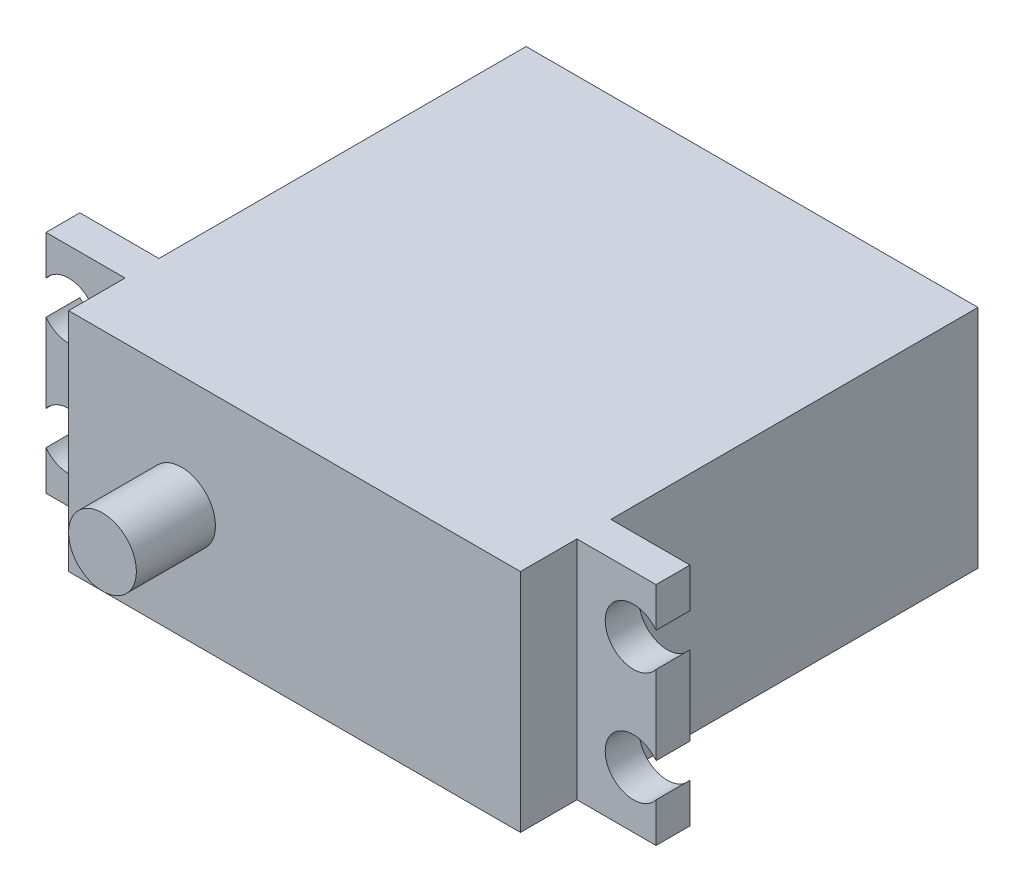
ISO-10303-21;
HEADER;
FILE_DESCRIPTION(('STEP AP214'),'2;1');
FILE_NAME('part.step','',(''),(''),'','','');
FILE_SCHEMA(('AUTOMOTIVE_DESIGN { 1 0 10303 214 1 1 1 1 }'));
ENDSEC;
DATA;
#1=APPLICATION_CONTEXT('core data for automotive mechanical design processes');
#2=APPLICATION_PROTOCOL_DEFINITION('international standard','automotive_design',2000,#1);
#3=PRODUCT_CONTEXT('',#1,'mechanical');
#4=PRODUCT('Part','Part','',(#3));
#5=PRODUCT_RELATED_PRODUCT_CATEGORY('part','',(#4));
#6=PRODUCT_DEFINITION_FORMATION('','',#4);
#7=PRODUCT_DEFINITION_CONTEXT('part definition',#1,'design');
#8=PRODUCT_DEFINITION('design','',#6,#7);
#9=PRODUCT_DEFINITION_SHAPE('','',#8);
#10=(LENGTH_UNIT() NAMED_UNIT(*) SI_UNIT(.MILLI.,.METRE.));
#11=(NAMED_UNIT(*) PLANE_ANGLE_UNIT() SI_UNIT($,.RADIAN.));
#12=(NAMED_UNIT(*) SI_UNIT($,.STERADIAN.) SOLID_ANGLE_UNIT());
#13=UNCERTAINTY_MEASURE_WITH_UNIT(LENGTH_MEASURE(1.E-05),#10,'distance_accuracy_value','');
#14=(GEOMETRIC_REPRESENTATION_CONTEXT(3) GLOBAL_UNCERTAINTY_ASSIGNED_CONTEXT((#13)) GLOBAL_UNIT_ASSIGNED_CONTEXT((#10,
#11,#12)) REPRESENTATION_CONTEXT('',''));
#15=CARTESIAN_POINT('',(0.,0.,0.));
#16=DIRECTION('',(0.,0.,1.));
#17=DIRECTION('',(1.,0.,0.));
#18=AXIS2_PLACEMENT_3D('',#15,#16,#17);
#19=CARTESIAN_POINT('',(47.,0.,32.5));
#20=DIRECTION('',(1.,0.,0.));
#21=DIRECTION('',(0.,0.,-1.));
#22=AXIS2_PLACEMENT_3D('',#19,#20,#21);
#23=PLANE('',#22);
#24=DIRECTION('',(0.,0.,1.));
#25=VECTOR('',#24,1.);
#26=CARTESIAN_POINT('',(47.,-3.5,25.5));
#27=LINE('',#26,#25);
#28=CARTESIAN_POINT('',(47.,-3.5,32.5));
#29=VERTEX_POINT('',#28);
#30=CARTESIAN_POINT('',(47.,-3.5,35.5));
#31=VERTEX_POINT('',#30);
#32=EDGE_CURVE('E60',#29,#31,#27,.T.);
#33=ORIENTED_EDGE('',*,*,#32,.F.);
#34=DIRECTION('',(0.,1.,0.));
#35=VECTOR('',#34,1.);
#36=CARTESIAN_POINT('',(47.,0.,32.5));
#37=LINE('',#36,#35);
#38=CARTESIAN_POINT('',(47.,0.,32.5));
#39=VERTEX_POINT('',#38);
#40=EDGE_CURVE('E289',#29,#39,#37,.T.);
#41=ORIENTED_EDGE('',*,*,#40,.T.);
#42=DIRECTION('',(0.,0.,1.));
#43=VECTOR('',#42,1.);
#44=CARTESIAN_POINT('',(47.,0.,32.5));
#45=LINE('',#44,#43);
#46=CARTESIAN_POINT('',(47.,0.,35.5));
#47=VERTEX_POINT('',#46);
#48=EDGE_CURVE('E377',#39,#47,#45,.T.);
#49=ORIENTED_EDGE('',*,*,#48,.T.);
#50=DIRECTION('',(0.,1.,0.));
#51=VECTOR('',#50,1.);
#52=CARTESIAN_POINT('',(47.,0.,35.5));
#53=LINE('',#52,#51);
#54=EDGE_CURVE('E273',#31,#47,#53,.T.);
#55=ORIENTED_EDGE('',*,*,#54,.F.);
#56=EDGE_LOOP('',(#33,#41,#49,#55));
#57=FACE_BOUND('',#56,.T.);
#58=ADVANCED_FACE('F45',(#57),#23,.T.);
#59=DIRECTION('',(0.,0.,1.));
#60=VECTOR('',#59,1.);
#61=CARTESIAN_POINT('',(47.,-6.5,25.5));
#62=LINE('',#61,#60);
#63=CARTESIAN_POINT('',(47.,-6.5,35.5));
#64=VERTEX_POINT('',#63);
#65=CARTESIAN_POINT('',(47.,-6.5,32.5));
#66=VERTEX_POINT('',#65);
#67=EDGE_CURVE('E230',#64,#66,#62,.F.);
#68=ORIENTED_EDGE('',*,*,#67,.F.);
#69=CARTESIAN_POINT('',(47.,-13.5,35.5));
#70=VERTEX_POINT('',#69);
#71=EDGE_CURVE('E271',#70,#64,#53,.T.);
#72=ORIENTED_EDGE('',*,*,#71,.F.);
#73=DIRECTION('',(0.,0.,1.));
#74=VECTOR('',#73,1.);
#75=CARTESIAN_POINT('',(47.,-13.5,25.5));
#76=LINE('',#75,#74);
#77=CARTESIAN_POINT('',(47.,-13.5,32.5));
#78=VERTEX_POINT('',#77);
#79=EDGE_CURVE('E68',#78,#70,#76,.T.);
#80=ORIENTED_EDGE('',*,*,#79,.F.);
#81=EDGE_CURVE('E288',#78,#66,#37,.T.);
#82=ORIENTED_EDGE('',*,*,#81,.T.);
#83=EDGE_LOOP('',(#68,#72,#80,#82));
#84=FACE_BOUND('',#83,.T.);
#85=ADVANCED_FACE('F398',(#84),#23,.T.);
#86=CARTESIAN_POINT('',(-7.,-20.,32.5));
#87=DIRECTION('',(-1.,0.,0.));
#88=DIRECTION('',(0.,0.,1.));
#89=AXIS2_PLACEMENT_3D('',#86,#87,#88);
#90=PLANE('',#89);
#91=DIRECTION('',(0.,0.,1.));
#92=VECTOR('',#91,1.);
#93=CARTESIAN_POINT('',(-7.,-16.5,25.5));
#94=LINE('',#93,#92);
#95=CARTESIAN_POINT('',(-7.,-16.5,32.5));
#96=VERTEX_POINT('',#95);
#97=CARTESIAN_POINT('',(-7.,-16.5,35.5));
#98=VERTEX_POINT('',#97);
#99=EDGE_CURVE('E241',#96,#98,#94,.T.);
#100=ORIENTED_EDGE('',*,*,#99,.F.);
#101=DIRECTION('',(0.,-1.,0.));
#102=VECTOR('',#101,1.);
#103=CARTESIAN_POINT('',(-7.,-20.,32.5));
#104=LINE('',#103,#102);
#105=CARTESIAN_POINT('',(-7.,-20.,32.5));
#106=VERTEX_POINT('',#105);
#107=EDGE_CURVE('E223',#96,#106,#104,.T.);
#108=ORIENTED_EDGE('',*,*,#107,.T.);
#109=DIRECTION('',(0.,0.,1.));
#110=VECTOR('',#109,1.);
#111=CARTESIAN_POINT('',(-7.,-20.,32.5));
#112=LINE('',#111,#110);
#113=CARTESIAN_POINT('',(-7.,-20.,35.5));
#114=VERTEX_POINT('',#113);
#115=EDGE_CURVE('E280',#106,#114,#112,.T.);
#116=ORIENTED_EDGE('',*,*,#115,.T.);
#117=DIRECTION('',(0.,-1.,0.));
#118=VECTOR('',#117,1.);
#119=CARTESIAN_POINT('',(-7.,-20.,35.5));
#120=LINE('',#119,#118);
#121=EDGE_CURVE('E208',#98,#114,#120,.T.);
#122=ORIENTED_EDGE('',*,*,#121,.F.);
#123=EDGE_LOOP('',(#100,#108,#116,#122));
#124=FACE_BOUND('',#123,.T.);
#125=ADVANCED_FACE('F300',(#124),#90,.T.);
#126=DIRECTION('',(0.,0.,1.));
#127=VECTOR('',#126,1.);
#128=CARTESIAN_POINT('',(-7.,-13.5,25.5));
#129=LINE('',#128,#127);
#130=CARTESIAN_POINT('',(-7.,-13.5,35.5));
#131=VERTEX_POINT('',#130);
#132=CARTESIAN_POINT('',(-7.,-13.5,32.5));
#133=VERTEX_POINT('',#132);
#134=EDGE_CURVE('E243',#131,#133,#129,.F.);
#135=ORIENTED_EDGE('',*,*,#134,.F.);
#136=CARTESIAN_POINT('',(-7.,-6.5,35.5));
#137=VERTEX_POINT('',#136);
#138=EDGE_CURVE('E206',#137,#131,#120,.T.);
#139=ORIENTED_EDGE('',*,*,#138,.F.);
#140=DIRECTION('',(0.,0.,1.));
#141=VECTOR('',#140,1.);
#142=CARTESIAN_POINT('',(-7.,-6.5,25.5));
#143=LINE('',#142,#141);
#144=CARTESIAN_POINT('',(-7.,-6.5,32.5));
#145=VERTEX_POINT('',#144);
#146=EDGE_CURVE('E185',#145,#137,#143,.T.);
#147=ORIENTED_EDGE('',*,*,#146,.F.);
#148=EDGE_CURVE('E222',#145,#133,#104,.T.);
#149=ORIENTED_EDGE('',*,*,#148,.T.);
#150=EDGE_LOOP('',(#135,#139,#147,#149));
#151=FACE_BOUND('',#150,.T.);
#152=ADVANCED_FACE('F443',(#151),#90,.T.);
#153=CARTESIAN_POINT('',(0.,0.,40.5));
#154=DIRECTION('',(1.,0.,0.));
#155=DIRECTION('',(0.,1.,0.));
#156=AXIS2_PLACEMENT_3D('',#153,#154,#155);
#157=PLANE('',#156);
#158=DIRECTION('',(0.,1.,0.));
#159=VECTOR('',#158,1.);
#160=CARTESIAN_POINT('',(0.,-20.,35.5));
#161=LINE('',#160,#159);
#162=CARTESIAN_POINT('',(0.,-20.,35.5));
#163=VERTEX_POINT('',#162);
#164=CARTESIAN_POINT('',(0.,0.,35.5));
#165=VERTEX_POINT('',#164);
#166=EDGE_CURVE('E214',#163,#165,#161,.T.);
#167=ORIENTED_EDGE('',*,*,#166,.F.);
#168=DIRECTION('',(0.,0.,-1.));
#169=VECTOR('',#168,1.);
#170=CARTESIAN_POINT('',(0.,-20.,40.5));
#171=LINE('',#170,#169);
#172=CARTESIAN_POINT('',(0.,-20.,40.5));
#173=VERTEX_POINT('',#172);
#174=EDGE_CURVE('E190',#173,#163,#171,.T.);
#175=ORIENTED_EDGE('',*,*,#174,.F.);
#176=DIRECTION('',(0.,-1.,0.));
#177=VECTOR('',#176,1.);
#178=CARTESIAN_POINT('',(0.,0.,40.5));
#179=LINE('',#178,#177);
#180=CARTESIAN_POINT('',(0.,0.,40.5));
#181=VERTEX_POINT('',#180);
#182=EDGE_CURVE('E316',#181,#173,#179,.T.);
#183=ORIENTED_EDGE('',*,*,#182,.F.);
#184=DIRECTION('',(0.,0.,-1.));
#185=VECTOR('',#184,1.);
#186=CARTESIAN_POINT('',(0.,0.,40.5));
#187=LINE('',#186,#185);
#188=EDGE_CURVE('E314',#181,#165,#187,.T.);
#189=ORIENTED_EDGE('',*,*,#188,.T.);
#190=EDGE_LOOP('',(#167,#175,#183,#189));
#191=FACE_BOUND('',#190,.T.);
#192=ADVANCED_FACE('F311',(#191),#157,.F.);
#193=CARTESIAN_POINT('',(40.,0.,40.5));
#194=DIRECTION('',(-1.,0.,0.));
#195=DIRECTION('',(0.,0.,1.));
#196=AXIS2_PLACEMENT_3D('',#193,#194,#195);
#197=PLANE('',#196);
#198=DIRECTION('',(0.,-1.,0.));
#199=VECTOR('',#198,1.);
#200=CARTESIAN_POINT('',(40.,0.,35.5));
#201=LINE('',#200,#199);
#202=CARTESIAN_POINT('',(40.,0.,35.5));
#203=VERTEX_POINT('',#202);
#204=CARTESIAN_POINT('',(40.,-20.,35.5));
#205=VERTEX_POINT('',#204);
#206=EDGE_CURVE('E279',#203,#205,#201,.T.);
#207=ORIENTED_EDGE('',*,*,#206,.F.);
#208=DIRECTION('',(0.,0.,-1.));
#209=VECTOR('',#208,1.);
#210=CARTESIAN_POINT('',(40.,0.,40.5));
#211=LINE('',#210,#209);
#212=CARTESIAN_POINT('',(40.,0.,40.5));
#213=VERTEX_POINT('',#212);
#214=EDGE_CURVE('E322',#213,#203,#211,.T.);
#215=ORIENTED_EDGE('',*,*,#214,.F.);
#216=DIRECTION('',(0.,1.,0.));
#217=VECTOR('',#216,1.);
#218=CARTESIAN_POINT('',(40.,0.,40.5));
#219=LINE('',#218,#217);
#220=CARTESIAN_POINT('',(40.,-20.,40.5));
#221=VERTEX_POINT('',#220);
#222=EDGE_CURVE('E364',#221,#213,#219,.T.);
#223=ORIENTED_EDGE('',*,*,#222,.F.);
#224=DIRECTION('',(0.,0.,-1.));
#225=VECTOR('',#224,1.);
#226=CARTESIAN_POINT('',(40.,-20.,40.5));
#227=LINE('',#226,#225);
#228=EDGE_CURVE('E331',#221,#205,#227,.T.);
#229=ORIENTED_EDGE('',*,*,#228,.T.);
#230=EDGE_LOOP('',(#207,#215,#223,#229));
#231=FACE_BOUND('',#230,.T.);
#232=ADVANCED_FACE('F375',(#231),#197,.F.);
#233=CARTESIAN_POINT('',(0.,-20.,32.5));
#234=VERTEX_POINT('',#233);
#235=CARTESIAN_POINT('',(0.,-20.,0.));
#236=VERTEX_POINT('',#235);
#237=EDGE_CURVE('E334',#234,#236,#171,.T.);
#238=ORIENTED_EDGE('',*,*,#237,.F.);
#239=DIRECTION('',(0.,1.,0.));
#240=VECTOR('',#239,1.);
#241=CARTESIAN_POINT('',(0.,-20.,32.5));
#242=LINE('',#241,#240);
#243=CARTESIAN_POINT('',(0.,0.,32.5));
#244=VERTEX_POINT('',#243);
#245=EDGE_CURVE('E209',#234,#244,#242,.T.);
#246=ORIENTED_EDGE('',*,*,#245,.T.);
#247=CARTESIAN_POINT('',(0.,0.,0.));
#248=VERTEX_POINT('',#247);
#249=EDGE_CURVE('E320',#244,#248,#187,.T.);
#250=ORIENTED_EDGE('',*,*,#249,.T.);
#251=DIRECTION('',(0.,-1.,0.));
#252=VECTOR('',#251,1.);
#253=CARTESIAN_POINT('',(0.,0.,0.));
#254=LINE('',#253,#252);
#255=EDGE_CURVE('E346',#248,#236,#254,.T.);
#256=ORIENTED_EDGE('',*,*,#255,.T.);
#257=EDGE_LOOP('',(#238,#246,#250,#256));
#258=FACE_BOUND('',#257,.T.);
#259=ADVANCED_FACE('F47',(#258),#157,.F.);
#260=CARTESIAN_POINT('',(0.,-20.,40.5));
#261=DIRECTION('',(0.,1.,0.));
#262=DIRECTION('',(0.,0.,1.));
#263=AXIS2_PLACEMENT_3D('',#260,#261,#262);
#264=PLANE('',#263);
#265=DIRECTION('',(1.,0.,0.));
#266=VECTOR('',#265,1.);
#267=CARTESIAN_POINT('',(0.,-20.,0.));
#268=LINE('',#267,#266);
#269=CARTESIAN_POINT('',(40.,-20.,0.));
#270=VERTEX_POINT('',#269);
#271=EDGE_CURVE('E338',#236,#270,#268,.T.);
#272=ORIENTED_EDGE('',*,*,#271,.T.);
#273=CARTESIAN_POINT('',(40.,-20.,32.5));
#274=VERTEX_POINT('',#273);
#275=EDGE_CURVE('E330',#274,#270,#227,.T.);
#276=ORIENTED_EDGE('',*,*,#275,.F.);
#277=DIRECTION('',(1.,0.,0.));
#278=VECTOR('',#277,1.);
#279=CARTESIAN_POINT('',(40.,-20.,32.5));
#280=LINE('',#279,#278);
#281=CARTESIAN_POINT('',(47.,-20.,32.5));
#282=VERTEX_POINT('',#281);
#283=EDGE_CURVE('E290',#274,#282,#280,.T.);
#284=ORIENTED_EDGE('',*,*,#283,.T.);
#285=DIRECTION('',(0.,0.,1.));
#286=VECTOR('',#285,1.);
#287=CARTESIAN_POINT('',(47.,-20.,32.5));
#288=LINE('',#287,#286);
#289=CARTESIAN_POINT('',(47.,-20.,35.5));
#290=VERTEX_POINT('',#289);
#291=EDGE_CURVE('E286',#282,#290,#288,.T.);
#292=ORIENTED_EDGE('',*,*,#291,.T.);
#293=DIRECTION('',(1.,0.,0.));
#294=VECTOR('',#293,1.);
#295=CARTESIAN_POINT('',(40.,-20.,35.5));
#296=LINE('',#295,#294);
#297=EDGE_CURVE('E269',#205,#290,#296,.T.);
#298=ORIENTED_EDGE('',*,*,#297,.F.);
#299=ORIENTED_EDGE('',*,*,#228,.F.);
#300=DIRECTION('',(1.,0.,0.));
#301=VECTOR('',#300,1.);
#302=CARTESIAN_POINT('',(0.,-20.,40.5));
#303=LINE('',#302,#301);
#304=EDGE_CURVE('E361',#173,#221,#303,.T.);
#305=ORIENTED_EDGE('',*,*,#304,.F.);
#306=ORIENTED_EDGE('',*,*,#174,.T.);
#307=DIRECTION('',(1.,0.,0.));
#308=VECTOR('',#307,1.);
#309=CARTESIAN_POINT('',(0.,-20.,35.5));
#310=LINE('',#309,#308);
#311=EDGE_CURVE('E205',#114,#163,#310,.T.);
#312=ORIENTED_EDGE('',*,*,#311,.F.);
#313=ORIENTED_EDGE('',*,*,#115,.F.);
#314=DIRECTION('',(1.,0.,0.));
#315=VECTOR('',#314,1.);
#316=CARTESIAN_POINT('',(0.,-20.,32.5));
#317=LINE('',#316,#315);
#318=EDGE_CURVE('E217',#106,#234,#317,.T.);
#319=ORIENTED_EDGE('',*,*,#318,.T.);
#320=ORIENTED_EDGE('',*,*,#237,.T.);
#321=EDGE_LOOP('',(#272,#276,#284,#292,#298,#299,#305,#306,#312,#313,#319,#320));
#322=FACE_BOUND('',#321,.T.);
#323=ADVANCED_FACE('F306',(#322),#264,.F.);
#324=CARTESIAN_POINT('',(40.,0.,32.5));
#325=VERTEX_POINT('',#324);
#326=CARTESIAN_POINT('',(40.,0.,0.));
#327=VERTEX_POINT('',#326);
#328=EDGE_CURVE('E319',#325,#327,#211,.T.);
#329=ORIENTED_EDGE('',*,*,#328,.F.);
#330=DIRECTION('',(0.,-1.,0.));
#331=VECTOR('',#330,1.);
#332=CARTESIAN_POINT('',(40.,0.,32.5));
#333=LINE('',#332,#331);
#334=EDGE_CURVE('E274',#325,#274,#333,.T.);
#335=ORIENTED_EDGE('',*,*,#334,.T.);
#336=ORIENTED_EDGE('',*,*,#275,.T.);
#337=DIRECTION('',(0.,1.,0.));
#338=VECTOR('',#337,1.);
#339=CARTESIAN_POINT('',(40.,0.,0.));
#340=LINE('',#339,#338);
#341=EDGE_CURVE('E348',#270,#327,#340,.T.);
#342=ORIENTED_EDGE('',*,*,#341,.T.);
#343=EDGE_LOOP('',(#329,#335,#336,#342));
#344=FACE_BOUND('',#343,.T.);
#345=ADVANCED_FACE('F394',(#344),#197,.F.);
#346=CARTESIAN_POINT('',(0.,0.,40.5));
#347=DIRECTION('',(0.,-1.,0.));
#348=DIRECTION('',(0.,0.,-1.));
#349=AXIS2_PLACEMENT_3D('',#346,#347,#348);
#350=PLANE('',#349);
#351=DIRECTION('',(-1.,0.,0.));
#352=VECTOR('',#351,1.);
#353=CARTESIAN_POINT('',(0.,0.,0.));
#354=LINE('',#353,#352);
#355=EDGE_CURVE('E326',#327,#248,#354,.T.);
#356=ORIENTED_EDGE('',*,*,#355,.T.);
#357=ORIENTED_EDGE('',*,*,#249,.F.);
#358=DIRECTION('',(-1.,0.,0.));
#359=VECTOR('',#358,1.);
#360=CARTESIAN_POINT('',(0.,0.,32.5));
#361=LINE('',#360,#359);
#362=CARTESIAN_POINT('',(-7.,0.,32.5));
#363=VERTEX_POINT('',#362);
#364=EDGE_CURVE('E224',#244,#363,#361,.T.);
#365=ORIENTED_EDGE('',*,*,#364,.T.);
#366=DIRECTION('',(0.,0.,1.));
#367=VECTOR('',#366,1.);
#368=CARTESIAN_POINT('',(-7.,0.,32.5));
#369=LINE('',#368,#367);
#370=CARTESIAN_POINT('',(-7.,0.,35.5));
#371=VERTEX_POINT('',#370);
#372=EDGE_CURVE('E220',#363,#371,#369,.T.);
#373=ORIENTED_EDGE('',*,*,#372,.T.);
#374=DIRECTION('',(-1.,0.,0.));
#375=VECTOR('',#374,1.);
#376=CARTESIAN_POINT('',(0.,0.,35.5));
#377=LINE('',#376,#375);
#378=EDGE_CURVE('E204',#165,#371,#377,.T.);
#379=ORIENTED_EDGE('',*,*,#378,.F.);
#380=ORIENTED_EDGE('',*,*,#188,.F.);
#381=DIRECTION('',(-1.,0.,0.));
#382=VECTOR('',#381,1.);
#383=CARTESIAN_POINT('',(0.,0.,40.5));
#384=LINE('',#383,#382);
#385=EDGE_CURVE('E324',#213,#181,#384,.T.);
#386=ORIENTED_EDGE('',*,*,#385,.F.);
#387=ORIENTED_EDGE('',*,*,#214,.T.);
#388=DIRECTION('',(-1.,0.,0.));
#389=VECTOR('',#388,1.);
#390=CARTESIAN_POINT('',(40.,0.,35.5));
#391=LINE('',#390,#389);
#392=EDGE_CURVE('E270',#47,#203,#391,.T.);
#393=ORIENTED_EDGE('',*,*,#392,.F.);
#394=ORIENTED_EDGE('',*,*,#48,.F.);
#395=DIRECTION('',(-1.,0.,0.));
#396=VECTOR('',#395,1.);
#397=CARTESIAN_POINT('',(40.,0.,32.5));
#398=LINE('',#397,#396);
#399=EDGE_CURVE('E283',#39,#325,#398,.T.);
#400=ORIENTED_EDGE('',*,*,#399,.T.);
#401=ORIENTED_EDGE('',*,*,#328,.T.);
#402=EDGE_LOOP('',(#356,#357,#365,#373,#379,#380,#386,#387,#393,#394,#400,#401));
#403=FACE_BOUND('',#402,.T.);
#404=ADVANCED_FACE('F370',(#403),#350,.F.);
#405=CARTESIAN_POINT('',(0.,0.,40.5));
#406=DIRECTION('',(0.,0.,1.));
#407=DIRECTION('',(1.,0.,0.));
#408=AXIS2_PLACEMENT_3D('',#405,#406,#407);
#409=PLANE('',#408);
#410=CARTESIAN_POINT('',(10.,-10.,40.5));
#411=DIRECTION('',(0.,0.,1.));
#412=DIRECTION('',(1.,0.,0.));
#413=AXIS2_PLACEMENT_3D('',#410,#411,#412);
#414=CIRCLE('',#413,3.);
#415=CARTESIAN_POINT('',(13.,-10.,40.5));
#416=VERTEX_POINT('',#415);
#417=EDGE_CURVE('E355',#416,#416,#414,.T.);
#418=ORIENTED_EDGE('',*,*,#417,.F.);
#419=EDGE_LOOP('',(#418));
#420=FACE_BOUND('',#419,.T.);
#421=ORIENTED_EDGE('',*,*,#182,.T.);
#422=ORIENTED_EDGE('',*,*,#304,.T.);
#423=ORIENTED_EDGE('',*,*,#222,.T.);
#424=ORIENTED_EDGE('',*,*,#385,.T.);
#425=EDGE_LOOP('',(#421,#422,#423,#424));
#426=FACE_BOUND('',#425,.T.);
#427=ADVANCED_FACE('F369',(#420,#426),#409,.T.);
#428=CARTESIAN_POINT('',(0.,0.,0.));
#429=DIRECTION('',(0.,0.,1.));
#430=DIRECTION('',(1.,0.,0.));
#431=AXIS2_PLACEMENT_3D('',#428,#429,#430);
#432=PLANE('',#431);
#433=ORIENTED_EDGE('',*,*,#255,.F.);
#434=ORIENTED_EDGE('',*,*,#355,.F.);
#435=ORIENTED_EDGE('',*,*,#341,.F.);
#436=ORIENTED_EDGE('',*,*,#271,.F.);
#437=EDGE_LOOP('',(#433,#434,#435,#436));
#438=FACE_BOUND('',#437,.T.);
#439=ADVANCED_FACE('F344',(#438),#432,.F.);
#440=CARTESIAN_POINT('',(10.,-10.,47.5));
#441=DIRECTION('',(0.,0.,-1.));
#442=DIRECTION('',(-1.,0.,0.));
#443=AXIS2_PLACEMENT_3D('',#440,#441,#442);
#444=CYLINDRICAL_SURFACE('',#443,3.);
#445=CARTESIAN_POINT('',(10.,-10.,47.5));
#446=DIRECTION('',(0.,0.,1.));
#447=DIRECTION('',(1.,0.,0.));
#448=AXIS2_PLACEMENT_3D('',#445,#446,#447);
#449=CIRCLE('',#448,3.);
#450=CARTESIAN_POINT('',(13.,-10.,47.5));
#451=VERTEX_POINT('',#450);
#452=EDGE_CURVE('E352',#451,#451,#449,.T.);
#453=ORIENTED_EDGE('',*,*,#452,.F.);
#454=EDGE_LOOP('',(#453));
#455=FACE_BOUND('',#454,.T.);
#456=ORIENTED_EDGE('',*,*,#417,.T.);
#457=EDGE_LOOP('',(#456));
#458=FACE_BOUND('',#457,.T.);
#459=ADVANCED_FACE('F384',(#455,#458),#444,.T.);
#460=CARTESIAN_POINT('',(10.,-10.,47.5));
#461=DIRECTION('',(0.,0.,1.));
#462=DIRECTION('',(1.,0.,0.));
#463=AXIS2_PLACEMENT_3D('',#460,#461,#462);
#464=PLANE('',#463);
#465=ORIENTED_EDGE('',*,*,#452,.T.);
#466=EDGE_LOOP('',(#465));
#467=FACE_BOUND('',#466,.T.);
#468=ADVANCED_FACE('F408',(#467),#464,.T.);
#469=DIRECTION('',(0.,0.,1.));
#470=VECTOR('',#469,1.);
#471=CARTESIAN_POINT('',(47.,-16.5,25.5));
#472=LINE('',#471,#470);
#473=CARTESIAN_POINT('',(47.,-16.5,35.5));
#474=VERTEX_POINT('',#473);
#475=CARTESIAN_POINT('',(47.,-16.5,32.5));
#476=VERTEX_POINT('',#475);
#477=EDGE_CURVE('E236',#474,#476,#472,.F.);
#478=ORIENTED_EDGE('',*,*,#477,.F.);
#479=EDGE_CURVE('E263',#290,#474,#53,.T.);
#480=ORIENTED_EDGE('',*,*,#479,.F.);
#481=ORIENTED_EDGE('',*,*,#291,.F.);
#482=EDGE_CURVE('E266',#282,#476,#37,.T.);
#483=ORIENTED_EDGE('',*,*,#482,.T.);
#484=EDGE_LOOP('',(#478,#480,#481,#483));
#485=FACE_BOUND('',#484,.T.);
#486=ADVANCED_FACE('F262',(#485),#23,.T.);
#487=CARTESIAN_POINT('',(0.,0.,32.5));
#488=DIRECTION('',(0.,0.,1.));
#489=DIRECTION('',(1.,0.,0.));
#490=AXIS2_PLACEMENT_3D('',#487,#488,#489);
#491=PLANE('',#490);
#492=ORIENTED_EDGE('',*,*,#40,.F.);
#493=CARTESIAN_POINT('',(45.,-5.,32.5));
#494=DIRECTION('',(0.,0.,1.));
#495=DIRECTION('',(1.,0.,0.));
#496=AXIS2_PLACEMENT_3D('',#493,#494,#495);
#497=CIRCLE('',#496,2.5);
#498=EDGE_CURVE('E232',#29,#66,#497,.T.);
#499=ORIENTED_EDGE('',*,*,#498,.T.);
#500=ORIENTED_EDGE('',*,*,#81,.F.);
#501=CARTESIAN_POINT('',(45.,-15.,32.5));
#502=DIRECTION('',(0.,0.,1.));
#503=DIRECTION('',(1.,0.,0.));
#504=AXIS2_PLACEMENT_3D('',#501,#502,#503);
#505=CIRCLE('',#504,2.5);
#506=EDGE_CURVE('E238',#78,#476,#505,.T.);
#507=ORIENTED_EDGE('',*,*,#506,.T.);
#508=ORIENTED_EDGE('',*,*,#482,.F.);
#509=ORIENTED_EDGE('',*,*,#283,.F.);
#510=ORIENTED_EDGE('',*,*,#334,.F.);
#511=ORIENTED_EDGE('',*,*,#399,.F.);
#512=EDGE_LOOP('',(#492,#499,#500,#507,#508,#509,#510,#511));
#513=FACE_BOUND('',#512,.T.);
#514=ADVANCED_FACE('F407',(#513),#491,.F.);
#515=CARTESIAN_POINT('',(0.,0.,35.5));
#516=DIRECTION('',(0.,0.,1.));
#517=DIRECTION('',(1.,0.,0.));
#518=AXIS2_PLACEMENT_3D('',#515,#516,#517);
#519=PLANE('',#518);
#520=CARTESIAN_POINT('',(45.,-5.,35.5));
#521=DIRECTION('',(0.,0.,1.));
#522=DIRECTION('',(1.,0.,0.));
#523=AXIS2_PLACEMENT_3D('',#520,#521,#522);
#524=CIRCLE('',#523,2.5);
#525=EDGE_CURVE('E250',#31,#64,#524,.T.);
#526=ORIENTED_EDGE('',*,*,#525,.F.);
#527=ORIENTED_EDGE('',*,*,#54,.T.);
#528=ORIENTED_EDGE('',*,*,#392,.T.);
#529=ORIENTED_EDGE('',*,*,#206,.T.);
#530=ORIENTED_EDGE('',*,*,#297,.T.);
#531=ORIENTED_EDGE('',*,*,#479,.T.);
#532=CARTESIAN_POINT('',(45.,-15.,35.5));
#533=DIRECTION('',(0.,0.,1.));
#534=DIRECTION('',(1.,0.,0.));
#535=AXIS2_PLACEMENT_3D('',#532,#533,#534);
#536=CIRCLE('',#535,2.5);
#537=EDGE_CURVE('E252',#70,#474,#536,.T.);
#538=ORIENTED_EDGE('',*,*,#537,.F.);
#539=ORIENTED_EDGE('',*,*,#71,.T.);
#540=EDGE_LOOP('',(#526,#527,#528,#529,#530,#531,#538,#539));
#541=FACE_BOUND('',#540,.T.);
#542=ADVANCED_FACE('F267',(#541),#519,.T.);
#543=DIRECTION('',(0.,0.,1.));
#544=VECTOR('',#543,1.);
#545=CARTESIAN_POINT('',(-7.,-3.5,25.5));
#546=LINE('',#545,#544);
#547=CARTESIAN_POINT('',(-7.,-3.5,35.5));
#548=VERTEX_POINT('',#547);
#549=CARTESIAN_POINT('',(-7.,-3.5,32.5));
#550=VERTEX_POINT('',#549);
#551=EDGE_CURVE('E182',#548,#550,#546,.F.);
#552=ORIENTED_EDGE('',*,*,#551,.F.);
#553=EDGE_CURVE('E195',#371,#548,#120,.T.);
#554=ORIENTED_EDGE('',*,*,#553,.F.);
#555=ORIENTED_EDGE('',*,*,#372,.F.);
#556=EDGE_CURVE('E198',#363,#550,#104,.T.);
#557=ORIENTED_EDGE('',*,*,#556,.T.);
#558=EDGE_LOOP('',(#552,#554,#555,#557));
#559=FACE_BOUND('',#558,.T.);
#560=ADVANCED_FACE('F194',(#559),#90,.T.);
#561=CARTESIAN_POINT('',(0.,0.,32.5));
#562=DIRECTION('',(0.,0.,1.));
#563=DIRECTION('',(1.,0.,0.));
#564=AXIS2_PLACEMENT_3D('',#561,#562,#563);
#565=PLANE('',#564);
#566=ORIENTED_EDGE('',*,*,#107,.F.);
#567=CARTESIAN_POINT('',(-5.,-15.,32.5));
#568=DIRECTION('',(0.,0.,1.));
#569=DIRECTION('',(1.,0.,0.));
#570=AXIS2_PLACEMENT_3D('',#567,#568,#569);
#571=CIRCLE('',#570,2.5);
#572=EDGE_CURVE('E245',#96,#133,#571,.T.);
#573=ORIENTED_EDGE('',*,*,#572,.T.);
#574=ORIENTED_EDGE('',*,*,#148,.F.);
#575=CARTESIAN_POINT('',(-5.,-5.,32.5));
#576=DIRECTION('',(0.,0.,1.));
#577=DIRECTION('',(1.,0.,0.));
#578=AXIS2_PLACEMENT_3D('',#575,#576,#577);
#579=CIRCLE('',#578,2.5);
#580=EDGE_CURVE('E199',#145,#550,#579,.T.);
#581=ORIENTED_EDGE('',*,*,#580,.T.);
#582=ORIENTED_EDGE('',*,*,#556,.F.);
#583=ORIENTED_EDGE('',*,*,#364,.F.);
#584=ORIENTED_EDGE('',*,*,#245,.F.);
#585=ORIENTED_EDGE('',*,*,#318,.F.);
#586=EDGE_LOOP('',(#566,#573,#574,#581,#582,#583,#584,#585));
#587=FACE_BOUND('',#586,.T.);
#588=ADVANCED_FACE('F487',(#587),#565,.F.);
#589=CARTESIAN_POINT('',(0.,0.,35.5));
#590=DIRECTION('',(0.,0.,1.));
#591=DIRECTION('',(1.,0.,0.));
#592=AXIS2_PLACEMENT_3D('',#589,#590,#591);
#593=PLANE('',#592);
#594=CARTESIAN_POINT('',(-5.,-15.,35.5));
#595=DIRECTION('',(0.,0.,1.));
#596=DIRECTION('',(1.,0.,0.));
#597=AXIS2_PLACEMENT_3D('',#594,#595,#596);
#598=CIRCLE('',#597,2.5);
#599=EDGE_CURVE('E11',#98,#131,#598,.T.);
#600=ORIENTED_EDGE('',*,*,#599,.F.);
#601=ORIENTED_EDGE('',*,*,#121,.T.);
#602=ORIENTED_EDGE('',*,*,#311,.T.);
#603=ORIENTED_EDGE('',*,*,#166,.T.);
#604=ORIENTED_EDGE('',*,*,#378,.T.);
#605=ORIENTED_EDGE('',*,*,#553,.T.);
#606=CARTESIAN_POINT('',(-5.,-5.,35.5));
#607=DIRECTION('',(0.,0.,1.));
#608=DIRECTION('',(1.,0.,0.));
#609=AXIS2_PLACEMENT_3D('',#606,#607,#608);
#610=CIRCLE('',#609,2.5);
#611=EDGE_CURVE('E53',#137,#548,#610,.T.);
#612=ORIENTED_EDGE('',*,*,#611,.F.);
#613=ORIENTED_EDGE('',*,*,#138,.T.);
#614=EDGE_LOOP('',(#600,#601,#602,#603,#604,#605,#612,#613));
#615=FACE_BOUND('',#614,.T.);
#616=ADVANCED_FACE('F202',(#615),#593,.T.);
#617=CARTESIAN_POINT('',(-5.,-5.,25.5));
#618=DIRECTION('',(0.,0.,1.));
#619=DIRECTION('',(1.,0.,0.));
#620=AXIS2_PLACEMENT_3D('',#617,#618,#619);
#621=CYLINDRICAL_SURFACE('',#620,2.5);
#622=ORIENTED_EDGE('',*,*,#146,.T.);
#623=ORIENTED_EDGE('',*,*,#611,.T.);
#624=ORIENTED_EDGE('',*,*,#551,.T.);
#625=ORIENTED_EDGE('',*,*,#580,.F.);
#626=EDGE_LOOP('',(#622,#623,#624,#625));
#627=FACE_BOUND('',#626,.T.);
#628=ADVANCED_FACE('F181',(#627),#621,.F.);
#629=CARTESIAN_POINT('',(-5.,-15.,25.5));
#630=DIRECTION('',(0.,0.,1.));
#631=DIRECTION('',(1.,0.,0.));
#632=AXIS2_PLACEMENT_3D('',#629,#630,#631);
#633=CYLINDRICAL_SURFACE('',#632,2.5);
#634=ORIENTED_EDGE('',*,*,#99,.T.);
#635=ORIENTED_EDGE('',*,*,#599,.T.);
#636=ORIENTED_EDGE('',*,*,#134,.T.);
#637=ORIENTED_EDGE('',*,*,#572,.F.);
#638=EDGE_LOOP('',(#634,#635,#636,#637));
#639=FACE_BOUND('',#638,.T.);
#640=ADVANCED_FACE('F523',(#639),#633,.F.);
#641=CARTESIAN_POINT('',(45.,-15.,25.5));
#642=DIRECTION('',(0.,0.,1.));
#643=DIRECTION('',(1.,0.,0.));
#644=AXIS2_PLACEMENT_3D('',#641,#642,#643);
#645=CYLINDRICAL_SURFACE('',#644,2.5);
#646=ORIENTED_EDGE('',*,*,#79,.T.);
#647=ORIENTED_EDGE('',*,*,#537,.T.);
#648=ORIENTED_EDGE('',*,*,#477,.T.);
#649=ORIENTED_EDGE('',*,*,#506,.F.);
#650=EDGE_LOOP('',(#646,#647,#648,#649));
#651=FACE_BOUND('',#650,.T.);
#652=ADVANCED_FACE('F254',(#651),#645,.F.);
#653=CARTESIAN_POINT('',(45.,-5.,25.5));
#654=DIRECTION('',(0.,0.,1.));
#655=DIRECTION('',(1.,0.,0.));
#656=AXIS2_PLACEMENT_3D('',#653,#654,#655);
#657=CYLINDRICAL_SURFACE('',#656,2.5);
#658=ORIENTED_EDGE('',*,*,#32,.T.);
#659=ORIENTED_EDGE('',*,*,#525,.T.);
#660=ORIENTED_EDGE('',*,*,#67,.T.);
#661=ORIENTED_EDGE('',*,*,#498,.F.);
#662=EDGE_LOOP('',(#658,#659,#660,#661));
#663=FACE_BOUND('',#662,.T.);
#664=ADVANCED_FACE('F537',(#663),#657,.F.);
#665=CLOSED_SHELL('',(#58,#85,#125,#152,#192,#232,#259,#323,#345,#404,#427,#439,#459,#468,#486,
#514,#542,#560,#588,#616,#628,#640,#652,#664));
#666=MANIFOLD_SOLID_BREP('B2',#665);
#667=ADVANCED_BREP_SHAPE_REPRESENTATION('',(#18,#666),#14);
#668=SHAPE_DEFINITION_REPRESENTATION(#9,#667);
ENDSEC;
END-ISO-10303-21;
